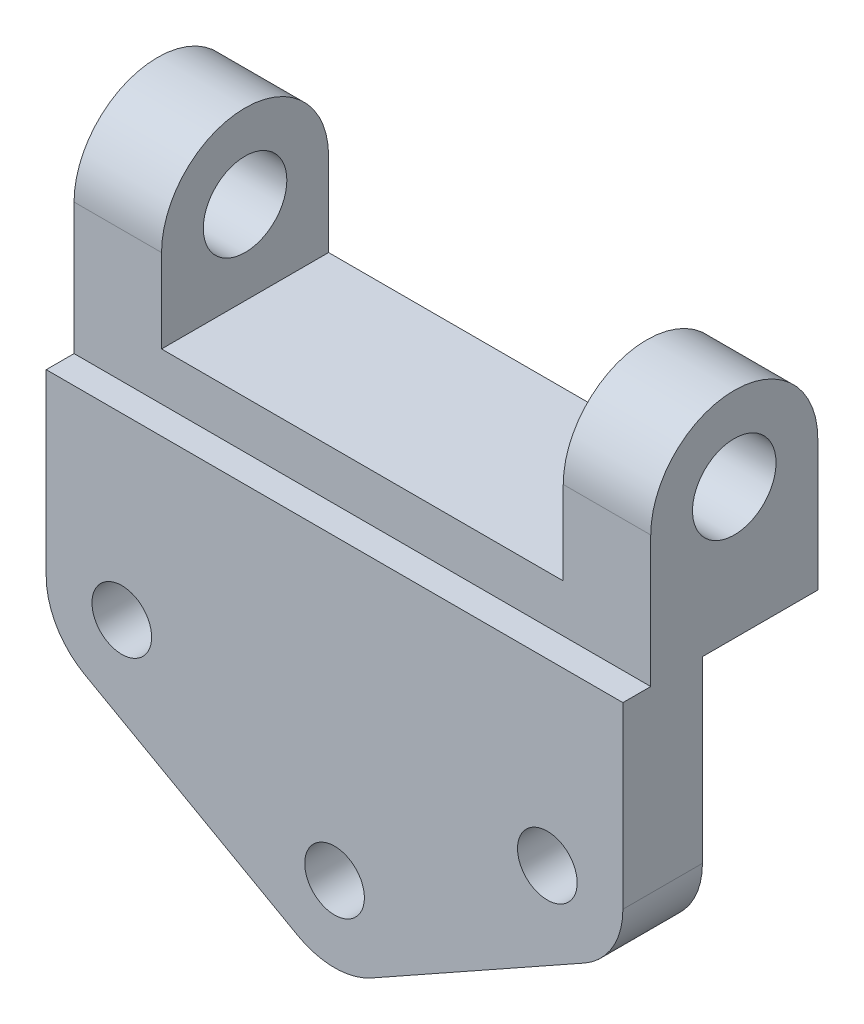
ISO-10303-21;
HEADER;
FILE_DESCRIPTION(('STEP AP214'),'2;1');
FILE_NAME('part.step','',(''),(''),'','','');
FILE_SCHEMA(('AUTOMOTIVE_DESIGN { 1 0 10303 214 1 1 1 1 }'));
ENDSEC;
DATA;
#1=APPLICATION_CONTEXT('core data for automotive mechanical design processes');
#2=APPLICATION_PROTOCOL_DEFINITION('international standard','automotive_design',2000,#1);
#3=PRODUCT_CONTEXT('',#1,'mechanical');
#4=PRODUCT('Part','Part','',(#3));
#5=PRODUCT_RELATED_PRODUCT_CATEGORY('part','',(#4));
#6=PRODUCT_DEFINITION_FORMATION('','',#4);
#7=PRODUCT_DEFINITION_CONTEXT('part definition',#1,'design');
#8=PRODUCT_DEFINITION('design','',#6,#7);
#9=PRODUCT_DEFINITION_SHAPE('','',#8);
#10=(LENGTH_UNIT() NAMED_UNIT(*) SI_UNIT(.MILLI.,.METRE.));
#11=(NAMED_UNIT(*) PLANE_ANGLE_UNIT() SI_UNIT($,.RADIAN.));
#12=(NAMED_UNIT(*) SI_UNIT($,.STERADIAN.) SOLID_ANGLE_UNIT());
#13=UNCERTAINTY_MEASURE_WITH_UNIT(LENGTH_MEASURE(1.E-05),#10,'distance_accuracy_value','');
#14=(GEOMETRIC_REPRESENTATION_CONTEXT(3) GLOBAL_UNCERTAINTY_ASSIGNED_CONTEXT((#13)) GLOBAL_UNIT_ASSIGNED_CONTEXT((#10,
#11,#12)) REPRESENTATION_CONTEXT('',''));
#15=CARTESIAN_POINT('',(0.,0.,0.));
#16=DIRECTION('',(0.,0.,1.));
#17=DIRECTION('',(1.,0.,0.));
#18=AXIS2_PLACEMENT_3D('',#15,#16,#17);
#19=CARTESIAN_POINT('',(0.,-12.,30.));
#20=DIRECTION('',(0.,-1.,0.));
#21=DIRECTION('',(0.,0.,-1.));
#22=AXIS2_PLACEMENT_3D('',#19,#20,#21);
#23=PLANE('',#22);
#24=DIRECTION('',(0.,0.,-1.));
#25=VECTOR('',#24,1.);
#26=CARTESIAN_POINT('',(-72.5,-12.,30.));
#27=LINE('',#26,#25);
#28=CARTESIAN_POINT('',(-72.5,-12.,0.));
#29=VERTEX_POINT('',#28);
#30=CARTESIAN_POINT('',(-72.5,-12.,-29.));
#31=VERTEX_POINT('',#30);
#32=EDGE_CURVE('E236',#29,#31,#27,.T.);
#33=ORIENTED_EDGE('',*,*,#32,.T.);
#34=DIRECTION('',(1.,0.,0.));
#35=VECTOR('',#34,1.);
#36=CARTESIAN_POINT('',(-161.696412483911,-12.,-29.));
#37=LINE('',#36,#35);
#38=CARTESIAN_POINT('',(72.5,-12.,-29.));
#39=VERTEX_POINT('',#38);
#40=EDGE_CURVE('E217',#31,#39,#37,.T.);
#41=ORIENTED_EDGE('',*,*,#40,.T.);
#42=DIRECTION('',(0.,0.,-1.));
#43=VECTOR('',#42,1.);
#44=CARTESIAN_POINT('',(72.5,-12.,30.));
#45=LINE('',#44,#43);
#46=CARTESIAN_POINT('',(72.5,-12.,0.));
#47=VERTEX_POINT('',#46);
#48=EDGE_CURVE('E208',#47,#39,#45,.T.);
#49=ORIENTED_EDGE('',*,*,#48,.F.);
#50=DIRECTION('',(-1.,0.,0.));
#51=VECTOR('',#50,1.);
#52=CARTESIAN_POINT('',(0.,-12.,0.));
#53=LINE('',#52,#51);
#54=EDGE_CURVE('E283',#47,#29,#53,.T.);
#55=ORIENTED_EDGE('',*,*,#54,.T.);
#56=EDGE_LOOP('',(#33,#41,#49,#55));
#57=FACE_BOUND('',#56,.T.);
#58=ADVANCED_FACE('F66',(#57),#23,.T.);
#59=CARTESIAN_POINT('',(-72.5,0.,20.));
#60=DIRECTION('',(1.,0.,0.));
#61=DIRECTION('',(0.,0.,-1.));
#62=AXIS2_PLACEMENT_3D('',#59,#60,#61);
#63=PLANE('',#62);
#64=CARTESIAN_POINT('',(-72.5,21.,-8.));
#65=DIRECTION('',(1.,0.,0.));
#66=DIRECTION('',(0.,0.,-1.));
#67=AXIS2_PLACEMENT_3D('',#64,#65,#66);
#68=CIRCLE('',#67,10.5);
#69=CARTESIAN_POINT('',(-72.5,21.,-18.5));
#70=VERTEX_POINT('',#69);
#71=EDGE_CURVE('E375',#70,#70,#68,.F.);
#72=ORIENTED_EDGE('',*,*,#71,.F.);
#73=EDGE_LOOP('',(#72));
#74=FACE_BOUND('',#73,.T.);
#75=DIRECTION('',(0.,1.,0.));
#76=VECTOR('',#75,1.);
#77=CARTESIAN_POINT('',(-72.5,0.,-29.));
#78=LINE('',#77,#76);
#79=CARTESIAN_POINT('',(-72.5,21.,-29.));
#80=VERTEX_POINT('',#79);
#81=EDGE_CURVE('E219',#31,#80,#78,.T.);
#82=ORIENTED_EDGE('',*,*,#81,.F.);
#83=ORIENTED_EDGE('',*,*,#32,.F.);
#84=DIRECTION('',(0.,-1.,0.));
#85=VECTOR('',#84,1.);
#86=CARTESIAN_POINT('',(-72.5,0.,0.));
#87=LINE('',#86,#85);
#88=CARTESIAN_POINT('',(-72.5,-57.,0.));
#89=VERTEX_POINT('',#88);
#90=EDGE_CURVE('E281',#29,#89,#87,.T.);
#91=ORIENTED_EDGE('',*,*,#90,.T.);
#92=DIRECTION('',(0.,0.,-1.));
#93=VECTOR('',#92,1.);
#94=CARTESIAN_POINT('',(-72.5,-57.,20.));
#95=LINE('',#94,#93);
#96=CARTESIAN_POINT('',(-72.5,-57.,20.));
#97=VERTEX_POINT('',#96);
#98=EDGE_CURVE('E320',#97,#89,#95,.T.);
#99=ORIENTED_EDGE('',*,*,#98,.F.);
#100=DIRECTION('',(0.,-1.,0.));
#101=VECTOR('',#100,1.);
#102=CARTESIAN_POINT('',(-72.5,0.,20.));
#103=LINE('',#102,#101);
#104=CARTESIAN_POINT('',(-72.5,-12.,20.));
#105=VERTEX_POINT('',#104);
#106=EDGE_CURVE('E254',#105,#97,#103,.T.);
#107=ORIENTED_EDGE('',*,*,#106,.F.);
#108=DIRECTION('',(0.,0.,1.));
#109=VECTOR('',#108,1.);
#110=CARTESIAN_POINT('',(-72.5,-12.,0.));
#111=LINE('',#110,#109);
#112=CARTESIAN_POINT('',(-72.5,-12.,13.));
#113=VERTEX_POINT('',#112);
#114=EDGE_CURVE('E212',#113,#105,#111,.T.);
#115=ORIENTED_EDGE('',*,*,#114,.F.);
#116=DIRECTION('',(0.,1.,0.));
#117=VECTOR('',#116,1.);
#118=CARTESIAN_POINT('',(-72.5,0.,13.));
#119=LINE('',#118,#117);
#120=CARTESIAN_POINT('',(-72.5,21.,13.));
#121=VERTEX_POINT('',#120);
#122=EDGE_CURVE('E368',#113,#121,#119,.T.);
#123=ORIENTED_EDGE('',*,*,#122,.T.);
#124=CARTESIAN_POINT('',(-72.5,21.,-8.));
#125=DIRECTION('',(1.,0.,0.));
#126=DIRECTION('',(0.,0.,-1.));
#127=AXIS2_PLACEMENT_3D('',#124,#125,#126);
#128=CIRCLE('',#127,21.);
#129=EDGE_CURVE('E224',#121,#80,#128,.F.);
#130=ORIENTED_EDGE('',*,*,#129,.T.);
#131=EDGE_LOOP('',(#82,#83,#91,#99,#107,#115,#123,#130));
#132=FACE_BOUND('',#131,.T.);
#133=ADVANCED_FACE('F361',(#74,#132),#63,.F.);
#134=CARTESIAN_POINT('',(72.5,0.,20.));
#135=DIRECTION('',(1.,0.,0.));
#136=DIRECTION('',(0.,0.,-1.));
#137=AXIS2_PLACEMENT_3D('',#134,#135,#136);
#138=PLANE('',#137);
#139=DIRECTION('',(0.,0.,-1.));
#140=VECTOR('',#139,1.);
#141=CARTESIAN_POINT('',(72.5,-12.,0.));
#142=LINE('',#141,#140);
#143=CARTESIAN_POINT('',(72.5,-12.,20.));
#144=VERTEX_POINT('',#143);
#145=CARTESIAN_POINT('',(72.5,-12.,13.));
#146=VERTEX_POINT('',#145);
#147=EDGE_CURVE('E12',#144,#146,#142,.T.);
#148=ORIENTED_EDGE('',*,*,#147,.F.);
#149=DIRECTION('',(0.,-1.,0.));
#150=VECTOR('',#149,1.);
#151=CARTESIAN_POINT('',(72.5,0.,20.));
#152=LINE('',#151,#150);
#153=CARTESIAN_POINT('',(72.5,-57.,20.));
#154=VERTEX_POINT('',#153);
#155=EDGE_CURVE('E248',#144,#154,#152,.T.);
#156=ORIENTED_EDGE('',*,*,#155,.T.);
#157=DIRECTION('',(0.,0.,-1.));
#158=VECTOR('',#157,1.);
#159=CARTESIAN_POINT('',(72.5,-57.,20.));
#160=LINE('',#159,#158);
#161=CARTESIAN_POINT('',(72.5,-57.,0.));
#162=VERTEX_POINT('',#161);
#163=EDGE_CURVE('E279',#154,#162,#160,.T.);
#164=ORIENTED_EDGE('',*,*,#163,.T.);
#165=DIRECTION('',(0.,-1.,0.));
#166=VECTOR('',#165,1.);
#167=CARTESIAN_POINT('',(72.5,0.,0.));
#168=LINE('',#167,#166);
#169=EDGE_CURVE('E250',#47,#162,#168,.T.);
#170=ORIENTED_EDGE('',*,*,#169,.F.);
#171=ORIENTED_EDGE('',*,*,#48,.T.);
#172=DIRECTION('',(0.,-1.,0.));
#173=VECTOR('',#172,1.);
#174=CARTESIAN_POINT('',(72.5,0.,-29.));
#175=LINE('',#174,#173);
#176=CARTESIAN_POINT('',(72.5,21.,-29.));
#177=VERTEX_POINT('',#176);
#178=EDGE_CURVE('E188',#177,#39,#175,.T.);
#179=ORIENTED_EDGE('',*,*,#178,.F.);
#180=CARTESIAN_POINT('',(72.5,21.,-8.));
#181=DIRECTION('',(1.,0.,0.));
#182=DIRECTION('',(0.,0.,-1.));
#183=AXIS2_PLACEMENT_3D('',#180,#181,#182);
#184=CIRCLE('',#183,21.);
#185=CARTESIAN_POINT('',(72.5,21.,13.));
#186=VERTEX_POINT('',#185);
#187=EDGE_CURVE('E191',#177,#186,#184,.T.);
#188=ORIENTED_EDGE('',*,*,#187,.T.);
#189=DIRECTION('',(0.,-1.,0.));
#190=VECTOR('',#189,1.);
#191=CARTESIAN_POINT('',(72.5,0.,13.));
#192=LINE('',#191,#190);
#193=EDGE_CURVE('E195',#186,#146,#192,.T.);
#194=ORIENTED_EDGE('',*,*,#193,.T.);
#195=EDGE_LOOP('',(#148,#156,#164,#170,#171,#179,#188,#194));
#196=FACE_BOUND('',#195,.T.);
#197=CARTESIAN_POINT('',(72.5,21.,-8.));
#198=DIRECTION('',(1.,0.,0.));
#199=DIRECTION('',(0.,0.,-1.));
#200=AXIS2_PLACEMENT_3D('',#197,#198,#199);
#201=CIRCLE('',#200,10.5);
#202=CARTESIAN_POINT('',(72.5,21.,-18.5));
#203=VERTEX_POINT('',#202);
#204=EDGE_CURVE('E205',#203,#203,#201,.T.);
#205=ORIENTED_EDGE('',*,*,#204,.F.);
#206=EDGE_LOOP('',(#205));
#207=FACE_BOUND('',#206,.T.);
#208=ADVANCED_FACE('F75',(#196,#207),#138,.T.);
#209=CARTESIAN_POINT('',(-53.5,-57.,20.));
#210=DIRECTION('',(0.,0.,-1.));
#211=DIRECTION('',(-1.,0.,0.));
#212=AXIS2_PLACEMENT_3D('',#209,#210,#211);
#213=CYLINDRICAL_SURFACE('',#212,19.);
#214=CARTESIAN_POINT('',(-53.5,-57.,0.));
#215=DIRECTION('',(0.,0.,1.));
#216=DIRECTION('',(1.,0.,0.));
#217=AXIS2_PLACEMENT_3D('',#214,#215,#216);
#218=CIRCLE('',#217,19.);
#219=CARTESIAN_POINT('',(-62.792895002889,-73.5723294218188,0.));
#220=VERTEX_POINT('',#219);
#221=EDGE_CURVE('E284',#89,#220,#218,.T.);
#222=ORIENTED_EDGE('',*,*,#221,.T.);
#223=DIRECTION('',(0.,0.,-1.));
#224=VECTOR('',#223,1.);
#225=CARTESIAN_POINT('',(-62.792895002889,-73.5723294218188,20.));
#226=LINE('',#225,#224);
#227=CARTESIAN_POINT('',(-62.792895002889,-73.5723294218188,20.));
#228=VERTEX_POINT('',#227);
#229=EDGE_CURVE('E314',#228,#220,#226,.T.);
#230=ORIENTED_EDGE('',*,*,#229,.F.);
#231=CARTESIAN_POINT('',(-53.5,-57.,20.));
#232=DIRECTION('',(0.,0.,1.));
#233=DIRECTION('',(1.,0.,0.));
#234=AXIS2_PLACEMENT_3D('',#231,#232,#233);
#235=CIRCLE('',#234,19.);
#236=EDGE_CURVE('E260',#97,#228,#235,.T.);
#237=ORIENTED_EDGE('',*,*,#236,.F.);
#238=ORIENTED_EDGE('',*,*,#98,.T.);
#239=EDGE_LOOP('',(#222,#230,#237,#238));
#240=FACE_BOUND('',#239,.T.);
#241=ADVANCED_FACE('F383',(#240),#213,.T.);
#242=CARTESIAN_POINT('',(-46.4076534586004,-82.760315334504,20.));
#243=DIRECTION('',(0.48909973699416,0.872227864306251,0.));
#244=DIRECTION('',(-0.872227864306251,0.48909973699416,0.));
#245=AXIS2_PLACEMENT_3D('',#242,#243,#244);
#246=PLANE('',#245);
#247=DIRECTION('',(0.872227864306251,-0.48909973699416,0.));
#248=VECTOR('',#247,1.);
#249=CARTESIAN_POINT('',(-46.4076534586004,-82.760315334504,0.));
#250=LINE('',#249,#248);
#251=CARTESIAN_POINT('',(-9.29289500288903,-103.572329421819,0.));
#252=VERTEX_POINT('',#251);
#253=EDGE_CURVE('E290',#220,#252,#250,.T.);
#254=ORIENTED_EDGE('',*,*,#253,.T.);
#255=DIRECTION('',(0.,0.,-1.));
#256=VECTOR('',#255,1.);
#257=CARTESIAN_POINT('',(-9.29289500288903,-103.572329421819,20.));
#258=LINE('',#257,#256);
#259=CARTESIAN_POINT('',(-9.29289500288903,-103.572329421819,20.));
#260=VERTEX_POINT('',#259);
#261=EDGE_CURVE('E313',#260,#252,#258,.T.);
#262=ORIENTED_EDGE('',*,*,#261,.F.);
#263=DIRECTION('',(0.872227864306251,-0.48909973699416,0.));
#264=VECTOR('',#263,1.);
#265=CARTESIAN_POINT('',(-46.4076534586004,-82.760315334504,20.));
#266=LINE('',#265,#264);
#267=EDGE_CURVE('E259',#228,#260,#266,.T.);
#268=ORIENTED_EDGE('',*,*,#267,.F.);
#269=ORIENTED_EDGE('',*,*,#229,.T.);
#270=EDGE_LOOP('',(#254,#262,#268,#269));
#271=FACE_BOUND('',#270,.T.);
#272=ADVANCED_FACE('F386',(#271),#246,.F.);
#273=CARTESIAN_POINT('',(0.,-87.,20.));
#274=DIRECTION('',(0.,0.,-1.));
#275=DIRECTION('',(-1.,0.,0.));
#276=AXIS2_PLACEMENT_3D('',#273,#274,#275);
#277=CYLINDRICAL_SURFACE('',#276,19.);
#278=CARTESIAN_POINT('',(0.,-87.,0.));
#279=DIRECTION('',(0.,0.,1.));
#280=DIRECTION('',(1.,0.,0.));
#281=AXIS2_PLACEMENT_3D('',#278,#279,#280);
#282=CIRCLE('',#281,19.);
#283=CARTESIAN_POINT('',(9.29289500288903,-103.572329421819,0.));
#284=VERTEX_POINT('',#283);
#285=EDGE_CURVE('E289',#252,#284,#282,.T.);
#286=ORIENTED_EDGE('',*,*,#285,.T.);
#287=DIRECTION('',(0.,0.,-1.));
#288=VECTOR('',#287,1.);
#289=CARTESIAN_POINT('',(9.29289500288903,-103.572329421819,20.));
#290=LINE('',#289,#288);
#291=CARTESIAN_POINT('',(9.29289500288903,-103.572329421819,20.));
#292=VERTEX_POINT('',#291);
#293=EDGE_CURVE('E310',#292,#284,#290,.T.);
#294=ORIENTED_EDGE('',*,*,#293,.F.);
#295=CARTESIAN_POINT('',(0.,-87.,20.));
#296=DIRECTION('',(0.,0.,1.));
#297=DIRECTION('',(1.,0.,0.));
#298=AXIS2_PLACEMENT_3D('',#295,#296,#297);
#299=CIRCLE('',#298,19.);
#300=EDGE_CURVE('E261',#260,#292,#299,.T.);
#301=ORIENTED_EDGE('',*,*,#300,.F.);
#302=ORIENTED_EDGE('',*,*,#261,.T.);
#303=EDGE_LOOP('',(#286,#294,#301,#302));
#304=FACE_BOUND('',#303,.T.);
#305=ADVANCED_FACE('F391',(#304),#277,.T.);
#306=CARTESIAN_POINT('',(46.4076534586004,-82.760315334504,20.));
#307=DIRECTION('',(0.48909973699416,-0.872227864306251,0.));
#308=DIRECTION('',(0.872227864306251,0.48909973699416,0.));
#309=AXIS2_PLACEMENT_3D('',#306,#307,#308);
#310=PLANE('',#309);
#311=DIRECTION('',(-0.872227864306251,-0.48909973699416,0.));
#312=VECTOR('',#311,1.);
#313=CARTESIAN_POINT('',(46.4076534586004,-82.760315334504,0.));
#314=LINE('',#313,#312);
#315=CARTESIAN_POINT('',(62.792895002889,-73.5723294218188,0.));
#316=VERTEX_POINT('',#315);
#317=EDGE_CURVE('E295',#316,#284,#314,.T.);
#318=ORIENTED_EDGE('',*,*,#317,.F.);
#319=DIRECTION('',(0.,0.,-1.));
#320=VECTOR('',#319,1.);
#321=CARTESIAN_POINT('',(62.792895002889,-73.5723294218188,20.));
#322=LINE('',#321,#320);
#323=CARTESIAN_POINT('',(62.792895002889,-73.5723294218188,20.));
#324=VERTEX_POINT('',#323);
#325=EDGE_CURVE('E307',#324,#316,#322,.T.);
#326=ORIENTED_EDGE('',*,*,#325,.F.);
#327=DIRECTION('',(-0.872227864306251,-0.48909973699416,0.));
#328=VECTOR('',#327,1.);
#329=CARTESIAN_POINT('',(46.4076534586004,-82.760315334504,20.));
#330=LINE('',#329,#328);
#331=EDGE_CURVE('E263',#324,#292,#330,.T.);
#332=ORIENTED_EDGE('',*,*,#331,.T.);
#333=ORIENTED_EDGE('',*,*,#293,.T.);
#334=EDGE_LOOP('',(#318,#326,#332,#333));
#335=FACE_BOUND('',#334,.T.);
#336=ADVANCED_FACE('F400',(#335),#310,.T.);
#337=CARTESIAN_POINT('',(0.,-87.,20.));
#338=DIRECTION('',(0.,0.,-1.));
#339=DIRECTION('',(-1.,0.,0.));
#340=AXIS2_PLACEMENT_3D('',#337,#338,#339);
#341=CYLINDRICAL_SURFACE('',#340,7.5);
#342=CARTESIAN_POINT('',(0.,-87.,20.));
#343=DIRECTION('',(0.,0.,1.));
#344=DIRECTION('',(1.,0.,0.));
#345=AXIS2_PLACEMENT_3D('',#342,#343,#344);
#346=CIRCLE('',#345,7.5);
#347=CARTESIAN_POINT('',(7.5,-87.,20.));
#348=VERTEX_POINT('',#347);
#349=EDGE_CURVE('E275',#348,#348,#346,.T.);
#350=ORIENTED_EDGE('',*,*,#349,.T.);
#351=EDGE_LOOP('',(#350));
#352=FACE_BOUND('',#351,.T.);
#353=CARTESIAN_POINT('',(0.,-87.,0.));
#354=DIRECTION('',(0.,0.,1.));
#355=DIRECTION('',(1.,0.,0.));
#356=AXIS2_PLACEMENT_3D('',#353,#354,#355);
#357=CIRCLE('',#356,7.5);
#358=CARTESIAN_POINT('',(7.5,-87.,0.));
#359=VERTEX_POINT('',#358);
#360=EDGE_CURVE('E302',#359,#359,#357,.T.);
#361=ORIENTED_EDGE('',*,*,#360,.F.);
#362=EDGE_LOOP('',(#361));
#363=FACE_BOUND('',#362,.T.);
#364=ADVANCED_FACE('F402',(#352,#363),#341,.F.);
#365=CARTESIAN_POINT('',(-53.5,-57.,20.));
#366=DIRECTION('',(0.,0.,-1.));
#367=DIRECTION('',(-1.,0.,0.));
#368=AXIS2_PLACEMENT_3D('',#365,#366,#367);
#369=CYLINDRICAL_SURFACE('',#368,7.5);
#370=CARTESIAN_POINT('',(-53.5,-57.,20.));
#371=DIRECTION('',(0.,0.,1.));
#372=DIRECTION('',(1.,0.,0.));
#373=AXIS2_PLACEMENT_3D('',#370,#371,#372);
#374=CIRCLE('',#373,7.5);
#375=CARTESIAN_POINT('',(-46.,-57.,20.));
#376=VERTEX_POINT('',#375);
#377=EDGE_CURVE('E267',#376,#376,#374,.T.);
#378=ORIENTED_EDGE('',*,*,#377,.T.);
#379=EDGE_LOOP('',(#378));
#380=FACE_BOUND('',#379,.T.);
#381=CARTESIAN_POINT('',(-53.5,-57.,0.));
#382=DIRECTION('',(0.,0.,1.));
#383=DIRECTION('',(1.,0.,0.));
#384=AXIS2_PLACEMENT_3D('',#381,#382,#383);
#385=CIRCLE('',#384,7.5);
#386=CARTESIAN_POINT('',(-46.,-57.,0.));
#387=VERTEX_POINT('',#386);
#388=EDGE_CURVE('E296',#387,#387,#385,.T.);
#389=ORIENTED_EDGE('',*,*,#388,.F.);
#390=EDGE_LOOP('',(#389));
#391=FACE_BOUND('',#390,.T.);
#392=ADVANCED_FACE('F408',(#380,#391),#369,.F.);
#393=CARTESIAN_POINT('',(53.5,-57.,20.));
#394=DIRECTION('',(0.,0.,-1.));
#395=DIRECTION('',(-1.,0.,0.));
#396=AXIS2_PLACEMENT_3D('',#393,#394,#395);
#397=CYLINDRICAL_SURFACE('',#396,19.);
#398=CARTESIAN_POINT('',(53.5,-57.,0.));
#399=DIRECTION('',(0.,0.,1.));
#400=DIRECTION('',(1.,0.,0.));
#401=AXIS2_PLACEMENT_3D('',#398,#399,#400);
#402=CIRCLE('',#401,19.);
#403=EDGE_CURVE('E293',#162,#316,#402,.F.);
#404=ORIENTED_EDGE('',*,*,#403,.F.);
#405=ORIENTED_EDGE('',*,*,#163,.F.);
#406=CARTESIAN_POINT('',(53.5,-57.,20.));
#407=DIRECTION('',(0.,0.,1.));
#408=DIRECTION('',(1.,0.,0.));
#409=AXIS2_PLACEMENT_3D('',#406,#407,#408);
#410=CIRCLE('',#409,19.);
#411=EDGE_CURVE('E266',#154,#324,#410,.F.);
#412=ORIENTED_EDGE('',*,*,#411,.T.);
#413=ORIENTED_EDGE('',*,*,#325,.T.);
#414=EDGE_LOOP('',(#404,#405,#412,#413));
#415=FACE_BOUND('',#414,.T.);
#416=ADVANCED_FACE('F353',(#415),#397,.T.);
#417=CARTESIAN_POINT('',(53.5,-57.,20.));
#418=DIRECTION('',(0.,0.,-1.));
#419=DIRECTION('',(-1.,0.,0.));
#420=AXIS2_PLACEMENT_3D('',#417,#418,#419);
#421=CYLINDRICAL_SURFACE('',#420,7.5);
#422=CARTESIAN_POINT('',(53.5,-57.,20.));
#423=DIRECTION('',(0.,0.,1.));
#424=DIRECTION('',(1.,0.,0.));
#425=AXIS2_PLACEMENT_3D('',#422,#423,#424);
#426=CIRCLE('',#425,7.5);
#427=CARTESIAN_POINT('',(61.,-57.,20.));
#428=VERTEX_POINT('',#427);
#429=EDGE_CURVE('E274',#428,#428,#426,.F.);
#430=ORIENTED_EDGE('',*,*,#429,.F.);
#431=EDGE_LOOP('',(#430));
#432=FACE_BOUND('',#431,.T.);
#433=CARTESIAN_POINT('',(53.5,-57.,0.));
#434=DIRECTION('',(0.,0.,1.));
#435=DIRECTION('',(1.,0.,0.));
#436=AXIS2_PLACEMENT_3D('',#433,#434,#435);
#437=CIRCLE('',#436,7.5);
#438=CARTESIAN_POINT('',(61.,-57.,0.));
#439=VERTEX_POINT('',#438);
#440=EDGE_CURVE('E252',#439,#439,#437,.F.);
#441=ORIENTED_EDGE('',*,*,#440,.T.);
#442=EDGE_LOOP('',(#441));
#443=FACE_BOUND('',#442,.T.);
#444=ADVANCED_FACE('F403',(#432,#443),#421,.F.);
#445=CARTESIAN_POINT('',(0.,0.,20.));
#446=DIRECTION('',(0.,0.,1.));
#447=DIRECTION('',(1.,0.,0.));
#448=AXIS2_PLACEMENT_3D('',#445,#446,#447);
#449=PLANE('',#448);
#450=ORIENTED_EDGE('',*,*,#155,.F.);
#451=DIRECTION('',(-1.,0.,0.));
#452=VECTOR('',#451,1.);
#453=CARTESIAN_POINT('',(0.,-12.,20.));
#454=LINE('',#453,#452);
#455=EDGE_CURVE('E253',#144,#105,#454,.T.);
#456=ORIENTED_EDGE('',*,*,#455,.T.);
#457=ORIENTED_EDGE('',*,*,#106,.T.);
#458=ORIENTED_EDGE('',*,*,#236,.T.);
#459=ORIENTED_EDGE('',*,*,#267,.T.);
#460=ORIENTED_EDGE('',*,*,#300,.T.);
#461=ORIENTED_EDGE('',*,*,#331,.F.);
#462=ORIENTED_EDGE('',*,*,#411,.F.);
#463=EDGE_LOOP('',(#450,#456,#457,#458,#459,#460,#461,#462));
#464=FACE_BOUND('',#463,.T.);
#465=ORIENTED_EDGE('',*,*,#377,.F.);
#466=EDGE_LOOP('',(#465));
#467=FACE_BOUND('',#466,.T.);
#468=ORIENTED_EDGE('',*,*,#349,.F.);
#469=EDGE_LOOP('',(#468));
#470=FACE_BOUND('',#469,.T.);
#471=ORIENTED_EDGE('',*,*,#429,.T.);
#472=EDGE_LOOP('',(#471));
#473=FACE_BOUND('',#472,.T.);
#474=ADVANCED_FACE('F341',(#464,#467,#470,#473),#449,.T.);
#475=CARTESIAN_POINT('',(0.,0.,0.));
#476=DIRECTION('',(0.,0.,1.));
#477=DIRECTION('',(1.,0.,0.));
#478=AXIS2_PLACEMENT_3D('',#475,#476,#477);
#479=PLANE('',#478);
#480=ORIENTED_EDGE('',*,*,#169,.T.);
#481=ORIENTED_EDGE('',*,*,#403,.T.);
#482=ORIENTED_EDGE('',*,*,#317,.T.);
#483=ORIENTED_EDGE('',*,*,#285,.F.);
#484=ORIENTED_EDGE('',*,*,#253,.F.);
#485=ORIENTED_EDGE('',*,*,#221,.F.);
#486=ORIENTED_EDGE('',*,*,#90,.F.);
#487=ORIENTED_EDGE('',*,*,#54,.F.);
#488=EDGE_LOOP('',(#480,#481,#482,#483,#484,#485,#486,#487));
#489=FACE_BOUND('',#488,.T.);
#490=ORIENTED_EDGE('',*,*,#388,.T.);
#491=EDGE_LOOP('',(#490));
#492=FACE_BOUND('',#491,.T.);
#493=ORIENTED_EDGE('',*,*,#360,.T.);
#494=EDGE_LOOP('',(#493));
#495=FACE_BOUND('',#494,.T.);
#496=ORIENTED_EDGE('',*,*,#440,.F.);
#497=EDGE_LOOP('',(#496));
#498=FACE_BOUND('',#497,.T.);
#499=ADVANCED_FACE('F354',(#489,#492,#495,#498),#479,.F.);
#500=CARTESIAN_POINT('',(-161.696412483911,-12.,0.));
#501=DIRECTION('',(0.,-1.,0.));
#502=DIRECTION('',(0.,0.,-1.));
#503=AXIS2_PLACEMENT_3D('',#500,#501,#502);
#504=PLANE('',#503);
#505=ORIENTED_EDGE('',*,*,#147,.T.);
#506=DIRECTION('',(1.,0.,0.));
#507=VECTOR('',#506,1.);
#508=CARTESIAN_POINT('',(-161.696412483911,-12.,13.));
#509=LINE('',#508,#507);
#510=EDGE_CURVE('E214',#113,#146,#509,.T.);
#511=ORIENTED_EDGE('',*,*,#510,.F.);
#512=ORIENTED_EDGE('',*,*,#114,.T.);
#513=ORIENTED_EDGE('',*,*,#455,.F.);
#514=EDGE_LOOP('',(#505,#511,#512,#513));
#515=FACE_BOUND('',#514,.T.);
#516=ADVANCED_FACE('F416',(#515),#504,.F.);
#517=CARTESIAN_POINT('',(-161.696412483911,21.,-8.));
#518=DIRECTION('',(1.,0.,0.));
#519=DIRECTION('',(0.,0.,-1.));
#520=AXIS2_PLACEMENT_3D('',#517,#518,#519);
#521=CYLINDRICAL_SURFACE('',#520,21.);
#522=CARTESIAN_POINT('',(-50.5,21.,-8.));
#523=DIRECTION('',(-1.,0.,0.));
#524=DIRECTION('',(0.,0.,1.));
#525=AXIS2_PLACEMENT_3D('',#522,#523,#524);
#526=CIRCLE('',#525,21.);
#527=CARTESIAN_POINT('',(-50.5,21.,13.));
#528=VERTEX_POINT('',#527);
#529=CARTESIAN_POINT('',(-50.5,21.,-29.));
#530=VERTEX_POINT('',#529);
#531=EDGE_CURVE('E323',#528,#530,#526,.T.);
#532=ORIENTED_EDGE('',*,*,#531,.T.);
#533=DIRECTION('',(1.,0.,0.));
#534=VECTOR('',#533,1.);
#535=CARTESIAN_POINT('',(-161.696412483911,21.,-29.));
#536=LINE('',#535,#534);
#537=EDGE_CURVE('E92',#80,#530,#536,.T.);
#538=ORIENTED_EDGE('',*,*,#537,.F.);
#539=ORIENTED_EDGE('',*,*,#129,.F.);
#540=DIRECTION('',(1.,0.,0.));
#541=VECTOR('',#540,1.);
#542=CARTESIAN_POINT('',(-161.696412483911,21.,13.));
#543=LINE('',#542,#541);
#544=EDGE_CURVE('E87',#121,#528,#543,.T.);
#545=ORIENTED_EDGE('',*,*,#544,.T.);
#546=EDGE_LOOP('',(#532,#538,#539,#545));
#547=FACE_BOUND('',#546,.T.);
#548=ADVANCED_FACE('F329',(#547),#521,.T.);
#549=CARTESIAN_POINT('',(50.5,21.,13.));
#550=VERTEX_POINT('',#549);
#551=EDGE_CURVE('E196',#550,#186,#543,.T.);
#552=ORIENTED_EDGE('',*,*,#551,.T.);
#553=ORIENTED_EDGE('',*,*,#187,.F.);
#554=CARTESIAN_POINT('',(50.5,21.,-29.));
#555=VERTEX_POINT('',#554);
#556=EDGE_CURVE('E185',#555,#177,#536,.T.);
#557=ORIENTED_EDGE('',*,*,#556,.F.);
#558=CARTESIAN_POINT('',(50.5,21.,-8.));
#559=DIRECTION('',(-1.,0.,0.));
#560=DIRECTION('',(0.,0.,1.));
#561=AXIS2_PLACEMENT_3D('',#558,#559,#560);
#562=CIRCLE('',#561,21.);
#563=EDGE_CURVE('E235',#550,#555,#562,.T.);
#564=ORIENTED_EDGE('',*,*,#563,.F.);
#565=EDGE_LOOP('',(#552,#553,#557,#564));
#566=FACE_BOUND('',#565,.T.);
#567=ADVANCED_FACE('F198',(#566),#521,.T.);
#568=CARTESIAN_POINT('',(-161.696412483911,0.,13.));
#569=DIRECTION('',(0.,0.,1.));
#570=DIRECTION('',(0.,-1.,0.));
#571=AXIS2_PLACEMENT_3D('',#568,#569,#570);
#572=PLANE('',#571);
#573=DIRECTION('',(1.,0.,0.));
#574=VECTOR('',#573,1.);
#575=CARTESIAN_POINT('',(0.,0.,13.));
#576=LINE('',#575,#574);
#577=CARTESIAN_POINT('',(-50.5,0.,13.));
#578=VERTEX_POINT('',#577);
#579=CARTESIAN_POINT('',(50.5,0.,13.));
#580=VERTEX_POINT('',#579);
#581=EDGE_CURVE('E228',#578,#580,#576,.T.);
#582=ORIENTED_EDGE('',*,*,#581,.F.);
#583=DIRECTION('',(0.,1.,0.));
#584=VECTOR('',#583,1.);
#585=CARTESIAN_POINT('',(-50.5,0.,13.));
#586=LINE('',#585,#584);
#587=EDGE_CURVE('E77',#578,#528,#586,.T.);
#588=ORIENTED_EDGE('',*,*,#587,.T.);
#589=ORIENTED_EDGE('',*,*,#544,.F.);
#590=ORIENTED_EDGE('',*,*,#122,.F.);
#591=ORIENTED_EDGE('',*,*,#510,.T.);
#592=ORIENTED_EDGE('',*,*,#193,.F.);
#593=ORIENTED_EDGE('',*,*,#551,.F.);
#594=DIRECTION('',(0.,1.,0.));
#595=VECTOR('',#594,1.);
#596=CARTESIAN_POINT('',(50.5,0.,13.));
#597=LINE('',#596,#595);
#598=EDGE_CURVE('E227',#580,#550,#597,.T.);
#599=ORIENTED_EDGE('',*,*,#598,.F.);
#600=EDGE_LOOP('',(#582,#588,#589,#590,#591,#592,#593,#599));
#601=FACE_BOUND('',#600,.T.);
#602=ADVANCED_FACE('F324',(#601),#572,.T.);
#603=CARTESIAN_POINT('',(-161.696412483911,0.,-29.));
#604=DIRECTION('',(0.,0.,1.));
#605=DIRECTION('',(0.,-1.,0.));
#606=AXIS2_PLACEMENT_3D('',#603,#604,#605);
#607=PLANE('',#606);
#608=DIRECTION('',(0.,1.,0.));
#609=VECTOR('',#608,1.);
#610=CARTESIAN_POINT('',(50.5,0.,-29.));
#611=LINE('',#610,#609);
#612=CARTESIAN_POINT('',(50.5,0.,-29.));
#613=VERTEX_POINT('',#612);
#614=EDGE_CURVE('E187',#613,#555,#611,.T.);
#615=ORIENTED_EDGE('',*,*,#614,.T.);
#616=ORIENTED_EDGE('',*,*,#556,.T.);
#617=ORIENTED_EDGE('',*,*,#178,.T.);
#618=ORIENTED_EDGE('',*,*,#40,.F.);
#619=ORIENTED_EDGE('',*,*,#81,.T.);
#620=ORIENTED_EDGE('',*,*,#537,.T.);
#621=DIRECTION('',(0.,1.,0.));
#622=VECTOR('',#621,1.);
#623=CARTESIAN_POINT('',(-50.5,0.,-29.));
#624=LINE('',#623,#622);
#625=CARTESIAN_POINT('',(-50.5,0.,-29.));
#626=VERTEX_POINT('',#625);
#627=EDGE_CURVE('E319',#626,#530,#624,.T.);
#628=ORIENTED_EDGE('',*,*,#627,.F.);
#629=DIRECTION('',(1.,0.,0.));
#630=VECTOR('',#629,1.);
#631=CARTESIAN_POINT('',(0.,0.,-29.));
#632=LINE('',#631,#630);
#633=EDGE_CURVE('E225',#626,#613,#632,.T.);
#634=ORIENTED_EDGE('',*,*,#633,.T.);
#635=EDGE_LOOP('',(#615,#616,#617,#618,#619,#620,#628,#634));
#636=FACE_BOUND('',#635,.T.);
#637=ADVANCED_FACE('F184',(#636),#607,.F.);
#638=CARTESIAN_POINT('',(-161.696412483911,21.,-8.));
#639=DIRECTION('',(1.,0.,0.));
#640=DIRECTION('',(0.,0.,-1.));
#641=AXIS2_PLACEMENT_3D('',#638,#639,#640);
#642=CYLINDRICAL_SURFACE('',#641,10.5);
#643=ORIENTED_EDGE('',*,*,#71,.T.);
#644=EDGE_LOOP('',(#643));
#645=FACE_BOUND('',#644,.T.);
#646=CARTESIAN_POINT('',(-50.5,21.,-8.));
#647=DIRECTION('',(-1.,0.,0.));
#648=DIRECTION('',(0.,0.,1.));
#649=AXIS2_PLACEMENT_3D('',#646,#647,#648);
#650=CIRCLE('',#649,10.5);
#651=CARTESIAN_POINT('',(-50.5,21.,2.5));
#652=VERTEX_POINT('',#651);
#653=EDGE_CURVE('E74',#652,#652,#650,.T.);
#654=ORIENTED_EDGE('',*,*,#653,.F.);
#655=EDGE_LOOP('',(#654));
#656=FACE_BOUND('',#655,.T.);
#657=ADVANCED_FACE('F376',(#645,#656),#642,.F.);
#658=CARTESIAN_POINT('',(50.5,21.,-8.));
#659=DIRECTION('',(-1.,0.,0.));
#660=DIRECTION('',(0.,0.,1.));
#661=AXIS2_PLACEMENT_3D('',#658,#659,#660);
#662=CIRCLE('',#661,10.5);
#663=CARTESIAN_POINT('',(50.5,21.,2.5));
#664=VERTEX_POINT('',#663);
#665=EDGE_CURVE('E234',#664,#664,#662,.T.);
#666=ORIENTED_EDGE('',*,*,#665,.T.);
#667=EDGE_LOOP('',(#666));
#668=FACE_BOUND('',#667,.T.);
#669=ORIENTED_EDGE('',*,*,#204,.T.);
#670=EDGE_LOOP('',(#669));
#671=FACE_BOUND('',#670,.T.);
#672=ADVANCED_FACE('F430',(#668,#671),#642,.F.);
#673=CARTESIAN_POINT('',(-50.5,0.,30.));
#674=DIRECTION('',(-1.,0.,0.));
#675=DIRECTION('',(0.,0.,1.));
#676=AXIS2_PLACEMENT_3D('',#673,#674,#675);
#677=PLANE('',#676);
#678=ORIENTED_EDGE('',*,*,#653,.T.);
#679=EDGE_LOOP('',(#678));
#680=FACE_BOUND('',#679,.T.);
#681=ORIENTED_EDGE('',*,*,#587,.F.);
#682=DIRECTION('',(0.,0.,-1.));
#683=VECTOR('',#682,1.);
#684=CARTESIAN_POINT('',(-50.5,0.,30.));
#685=LINE('',#684,#683);
#686=EDGE_CURVE('E243',#578,#626,#685,.T.);
#687=ORIENTED_EDGE('',*,*,#686,.T.);
#688=ORIENTED_EDGE('',*,*,#627,.T.);
#689=ORIENTED_EDGE('',*,*,#531,.F.);
#690=EDGE_LOOP('',(#681,#687,#688,#689));
#691=FACE_BOUND('',#690,.T.);
#692=ADVANCED_FACE('F334',(#680,#691),#677,.F.);
#693=CARTESIAN_POINT('',(0.,0.,30.));
#694=DIRECTION('',(0.,1.,0.));
#695=DIRECTION('',(-1.,0.,0.));
#696=AXIS2_PLACEMENT_3D('',#693,#694,#695);
#697=PLANE('',#696);
#698=ORIENTED_EDGE('',*,*,#686,.F.);
#699=ORIENTED_EDGE('',*,*,#581,.T.);
#700=DIRECTION('',(0.,0.,-1.));
#701=VECTOR('',#700,1.);
#702=CARTESIAN_POINT('',(50.5,0.,30.));
#703=LINE('',#702,#701);
#704=EDGE_CURVE('E242',#580,#613,#703,.T.);
#705=ORIENTED_EDGE('',*,*,#704,.T.);
#706=ORIENTED_EDGE('',*,*,#633,.F.);
#707=EDGE_LOOP('',(#698,#699,#705,#706));
#708=FACE_BOUND('',#707,.T.);
#709=ADVANCED_FACE('F338',(#708),#697,.T.);
#710=CARTESIAN_POINT('',(50.5,0.,30.));
#711=DIRECTION('',(-1.,0.,0.));
#712=DIRECTION('',(0.,0.,1.));
#713=AXIS2_PLACEMENT_3D('',#710,#711,#712);
#714=PLANE('',#713);
#715=ORIENTED_EDGE('',*,*,#665,.F.);
#716=EDGE_LOOP('',(#715));
#717=FACE_BOUND('',#716,.T.);
#718=ORIENTED_EDGE('',*,*,#704,.F.);
#719=ORIENTED_EDGE('',*,*,#598,.T.);
#720=ORIENTED_EDGE('',*,*,#563,.T.);
#721=ORIENTED_EDGE('',*,*,#614,.F.);
#722=EDGE_LOOP('',(#718,#719,#720,#721));
#723=FACE_BOUND('',#722,.T.);
#724=ADVANCED_FACE('F337',(#717,#723),#714,.T.);
#725=CLOSED_SHELL('',(#58,#133,#208,#241,#272,#305,#336,#364,#392,#416,#444,#474,#499,#516,#548,
#567,#602,#637,#657,#672,#692,#709,#724));
#726=MANIFOLD_SOLID_BREP('B2',#725);
#727=ADVANCED_BREP_SHAPE_REPRESENTATION('',(#18,#726),#14);
#728=SHAPE_DEFINITION_REPRESENTATION(#9,#727);
ENDSEC;
END-ISO-10303-21;
